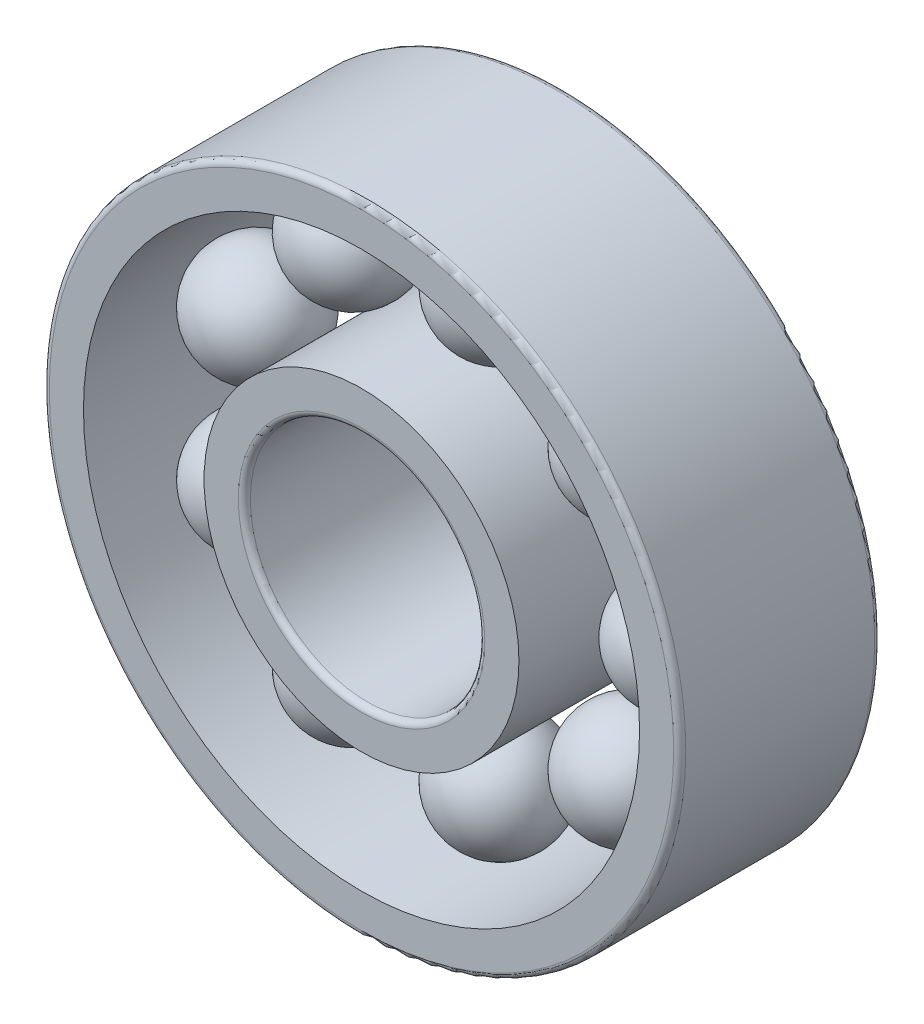
ISO-10303-21;
HEADER;
FILE_DESCRIPTION(('STEP AP214'),'2;1');
FILE_NAME('part.step','',(''),(''),'','','');
FILE_SCHEMA(('AUTOMOTIVE_DESIGN { 1 0 10303 214 1 1 1 1 }'));
ENDSEC;
DATA;
#1=APPLICATION_CONTEXT('core data for automotive mechanical design processes');
#2=APPLICATION_PROTOCOL_DEFINITION('international standard','automotive_design',2000,#1);
#3=PRODUCT_CONTEXT('',#1,'mechanical');
#4=PRODUCT('Part','Part','',(#3));
#5=PRODUCT_RELATED_PRODUCT_CATEGORY('part','',(#4));
#6=PRODUCT_DEFINITION_FORMATION('','',#4);
#7=PRODUCT_DEFINITION_CONTEXT('part definition',#1,'design');
#8=PRODUCT_DEFINITION('design','',#6,#7);
#9=PRODUCT_DEFINITION_SHAPE('','',#8);
#10=(LENGTH_UNIT() NAMED_UNIT(*) SI_UNIT(.MILLI.,.METRE.));
#11=(NAMED_UNIT(*) PLANE_ANGLE_UNIT() SI_UNIT($,.RADIAN.));
#12=(NAMED_UNIT(*) SI_UNIT($,.STERADIAN.) SOLID_ANGLE_UNIT());
#13=UNCERTAINTY_MEASURE_WITH_UNIT(LENGTH_MEASURE(1.E-05),#10,'distance_accuracy_value','');
#14=(GEOMETRIC_REPRESENTATION_CONTEXT(3) GLOBAL_UNCERTAINTY_ASSIGNED_CONTEXT((#13)) GLOBAL_UNIT_ASSIGNED_CONTEXT((#10,
#11,#12)) REPRESENTATION_CONTEXT('',''));
#15=CARTESIAN_POINT('',(0.,0.,0.));
#16=DIRECTION('',(0.,0.,1.));
#17=DIRECTION('',(1.,0.,0.));
#18=AXIS2_PLACEMENT_3D('',#15,#16,#17);
#19=CARTESIAN_POINT('',(4.97928888027336,-4.17811946296251,0.));
#20=DIRECTION('',(-0.766044443118978,0.64278760968654,0.));
#21=DIRECTION('',(0.,0.,-1.));
#22=AXIS2_PLACEMENT_3D('',#19,#20,#21);
#23=SPHERICAL_SURFACE('',#22,1.71);
#24=CARTESIAN_POINT('',(3.6693528825399,-3.07895265039852,0.));
#25=VERTEX_POINT('',#24);
#26=VERTEX_LOOP('',#25);
#27=FACE_BOUND('',#26,.T.);
#28=ADVANCED_FACE('F38',(#27),#23,.T.);
#29=CLOSED_SHELL('',(#28));
#30=MANIFOLD_SOLID_BREP('B2',#29);
#31=CARTESIAN_POINT('',(1.12871315483504,-6.40125039457935,0.));
#32=DIRECTION('',(-0.17364817766693,0.984807753012208,0.));
#33=DIRECTION('',(0.,0.,-1.));
#34=AXIS2_PLACEMENT_3D('',#31,#32,#33);
#35=SPHERICAL_SURFACE('',#34,1.71);
#36=CARTESIAN_POINT('',(0.831774771024595,-4.71722913692848,0.));
#37=VERTEX_POINT('',#36);
#38=VERTEX_LOOP('',#37);
#39=FACE_BOUND('',#38,.T.);
#40=ADVANCED_FACE('F57',(#39),#35,.T.);
#41=CLOSED_SHELL('',(#40));
#42=MANIFOLD_SOLID_BREP('B6',#41);
#43=CARTESIAN_POINT('',(-3.25,-5.62916512459885,0.));
#44=DIRECTION('',(0.5,0.866025403784438,0.));
#45=DIRECTION('',(0.,0.,-1.));
#46=AXIS2_PLACEMENT_3D('',#43,#44,#45);
#47=SPHERICAL_SURFACE('',#46,1.71);
#48=CARTESIAN_POINT('',(-2.395,-4.14826168412746,0.));
#49=VERTEX_POINT('',#48);
#50=VERTEX_LOOP('',#49);
#51=FACE_BOUND('',#50,.T.);
#52=ADVANCED_FACE('F76',(#51),#47,.T.);
#53=CLOSED_SHELL('',(#52));
#54=MANIFOLD_SOLID_BREP('B34',#53);
#55=CARTESIAN_POINT('',(-6.10800203510841,-2.22313093161685,0.));
#56=DIRECTION('',(0.939692620785908,0.342020143325669,0.));
#57=DIRECTION('',(0.,0.,-1.));
#58=AXIS2_PLACEMENT_3D('',#55,#56,#57);
#59=SPHERICAL_SURFACE('',#58,1.71);
#60=CARTESIAN_POINT('',(-4.5011276535645,-1.63827648652995,0.));
#61=VERTEX_POINT('',#60);
#62=VERTEX_LOOP('',#61);
#63=FACE_BOUND('',#62,.T.);
#64=ADVANCED_FACE('F95',(#63),#59,.T.);
#65=CLOSED_SHELL('',(#64));
#66=MANIFOLD_SOLID_BREP('B53',#65);
#67=CARTESIAN_POINT('',(-6.10800203510841,2.22313093161685,0.));
#68=DIRECTION('',(0.939692620785909,-0.342020143325669,0.));
#69=DIRECTION('',(0.,0.,-1.));
#70=AXIS2_PLACEMENT_3D('',#67,#68,#69);
#71=SPHERICAL_SURFACE('',#70,1.71);
#72=CARTESIAN_POINT('',(-4.5011276535645,1.63827648652995,0.));
#73=VERTEX_POINT('',#72);
#74=VERTEX_LOOP('',#73);
#75=FACE_BOUND('',#74,.T.);
#76=ADVANCED_FACE('F114',(#75),#71,.T.);
#77=CLOSED_SHELL('',(#76));
#78=MANIFOLD_SOLID_BREP('B72',#77);
#79=CARTESIAN_POINT('',(-3.25,5.62916512459885,0.));
#80=DIRECTION('',(0.5,-0.866025403784439,0.));
#81=DIRECTION('',(0.,0.,-1.));
#82=AXIS2_PLACEMENT_3D('',#79,#80,#81);
#83=SPHERICAL_SURFACE('',#82,1.71);
#84=CARTESIAN_POINT('',(-2.395,4.14826168412746,0.));
#85=VERTEX_POINT('',#84);
#86=VERTEX_LOOP('',#85);
#87=FACE_BOUND('',#86,.T.);
#88=ADVANCED_FACE('F133',(#87),#83,.T.);
#89=CLOSED_SHELL('',(#88));
#90=MANIFOLD_SOLID_BREP('B91',#89);
#91=CARTESIAN_POINT('',(1.12871315483505,6.40125039457935,0.));
#92=DIRECTION('',(-0.17364817766693,-0.984807753012208,0.));
#93=DIRECTION('',(0.,0.,-1.));
#94=AXIS2_PLACEMENT_3D('',#91,#92,#93);
#95=SPHERICAL_SURFACE('',#94,1.71);
#96=CARTESIAN_POINT('',(0.831774771024597,4.71722913692848,0.));
#97=VERTEX_POINT('',#96);
#98=VERTEX_LOOP('',#97);
#99=FACE_BOUND('',#98,.T.);
#100=ADVANCED_FACE('F152',(#99),#95,.T.);
#101=CLOSED_SHELL('',(#100));
#102=MANIFOLD_SOLID_BREP('B110',#101);
#103=CARTESIAN_POINT('',(4.97928888027336,4.17811946296251,0.));
#104=DIRECTION('',(-0.766044443118978,-0.642787609686539,0.));
#105=DIRECTION('',(0.,0.,-1.));
#106=AXIS2_PLACEMENT_3D('',#103,#104,#105);
#107=SPHERICAL_SURFACE('',#106,1.71);
#108=CARTESIAN_POINT('',(3.66935288253991,3.07895265039852,0.));
#109=VERTEX_POINT('',#108);
#110=VERTEX_LOOP('',#109);
#111=FACE_BOUND('',#110,.T.);
#112=ADVANCED_FACE('F171',(#111),#107,.T.);
#113=CLOSED_SHELL('',(#112));
#114=MANIFOLD_SOLID_BREP('B129',#113);
#115=CARTESIAN_POINT('',(6.5,0.,0.));
#116=DIRECTION('',(-1.,0.,0.));
#117=DIRECTION('',(0.,0.,-1.));
#118=AXIS2_PLACEMENT_3D('',#115,#116,#117);
#119=SPHERICAL_SURFACE('',#118,1.71);
#120=CARTESIAN_POINT('',(4.79,0.,0.));
#121=VERTEX_POINT('',#120);
#122=VERTEX_LOOP('',#121);
#123=FACE_BOUND('',#122,.T.);
#124=ADVANCED_FACE('F192',(#123),#119,.T.);
#125=CLOSED_SHELL('',(#124));
#126=MANIFOLD_SOLID_BREP('B148',#125);
#127=CARTESIAN_POINT('',(0.,0.,5.5));
#128=DIRECTION('',(0.,0.,1.));
#129=DIRECTION('',(1.,0.,0.));
#130=AXIS2_PLACEMENT_3D('',#127,#128,#129);
#131=CYLINDRICAL_SURFACE('',#130,8.3);
#132=CARTESIAN_POINT('',(0.,0.,3.));
#133=DIRECTION('',(0.,0.,1.));
#134=DIRECTION('',(1.,0.,0.));
#135=AXIS2_PLACEMENT_3D('',#132,#133,#134);
#136=CIRCLE('',#135,8.3);
#137=CARTESIAN_POINT('',(8.3,0.,3.));
#138=VERTEX_POINT('',#137);
#139=EDGE_CURVE('E232',#138,#138,#136,.T.);
#140=ORIENTED_EDGE('',*,*,#139,.T.);
#141=EDGE_LOOP('',(#140));
#142=FACE_BOUND('',#141,.T.);
#143=CARTESIAN_POINT('',(0.,0.,-3.));
#144=DIRECTION('',(0.,0.,1.));
#145=DIRECTION('',(1.,0.,0.));
#146=AXIS2_PLACEMENT_3D('',#143,#144,#145);
#147=CIRCLE('',#146,8.3);
#148=CARTESIAN_POINT('',(8.3,0.,-3.));
#149=VERTEX_POINT('',#148);
#150=EDGE_CURVE('E235',#149,#149,#147,.T.);
#151=ORIENTED_EDGE('',*,*,#150,.F.);
#152=EDGE_LOOP('',(#151));
#153=FACE_BOUND('',#152,.T.);
#154=ADVANCED_FACE('F212',(#142,#153),#131,.F.);
#155=CARTESIAN_POINT('',(8.3,0.,3.));
#156=DIRECTION('',(0.,0.,1.));
#157=DIRECTION('',(1.,0.,0.));
#158=AXIS2_PLACEMENT_3D('',#155,#156,#157);
#159=PLANE('',#158);
#160=CARTESIAN_POINT('',(0.,0.,3.));
#161=DIRECTION('',(0.,0.,1.));
#162=DIRECTION('',(1.,0.,0.));
#163=AXIS2_PLACEMENT_3D('',#160,#161,#162);
#164=CIRCLE('',#163,9.32);
#165=CARTESIAN_POINT('',(9.32,0.,3.));
#166=VERTEX_POINT('',#165);
#167=EDGE_CURVE('E191',#166,#166,#164,.T.);
#168=ORIENTED_EDGE('',*,*,#167,.T.);
#169=EDGE_LOOP('',(#168));
#170=FACE_BOUND('',#169,.T.);
#171=ORIENTED_EDGE('',*,*,#139,.F.);
#172=EDGE_LOOP('',(#171));
#173=FACE_BOUND('',#172,.T.);
#174=ADVANCED_FACE('F242',(#170,#173),#159,.T.);
#175=CARTESIAN_POINT('',(0.,0.,5.5));
#176=DIRECTION('',(0.,0.,1.));
#177=DIRECTION('',(1.,0.,0.));
#178=AXIS2_PLACEMENT_3D('',#175,#176,#177);
#179=CYLINDRICAL_SURFACE('',#178,9.5);
#180=CARTESIAN_POINT('',(0.,0.,-2.82));
#181=DIRECTION('',(0.,0.,-1.));
#182=DIRECTION('',(-1.,0.,0.));
#183=AXIS2_PLACEMENT_3D('',#180,#181,#182);
#184=CIRCLE('',#183,9.5);
#185=CARTESIAN_POINT('',(-9.5,0.,-2.82));
#186=VERTEX_POINT('',#185);
#187=EDGE_CURVE('E223',#186,#186,#184,.F.);
#188=ORIENTED_EDGE('',*,*,#187,.T.);
#189=EDGE_LOOP('',(#188));
#190=FACE_BOUND('',#189,.T.);
#191=CARTESIAN_POINT('',(0.,0.,2.82));
#192=DIRECTION('',(0.,0.,1.));
#193=DIRECTION('',(1.,0.,0.));
#194=AXIS2_PLACEMENT_3D('',#191,#192,#193);
#195=CIRCLE('',#194,9.5);
#196=CARTESIAN_POINT('',(9.5,0.,2.82));
#197=VERTEX_POINT('',#196);
#198=EDGE_CURVE('E227',#197,#197,#195,.F.);
#199=ORIENTED_EDGE('',*,*,#198,.T.);
#200=EDGE_LOOP('',(#199));
#201=FACE_BOUND('',#200,.T.);
#202=ADVANCED_FACE('F248',(#190,#201),#179,.T.);
#203=CARTESIAN_POINT('',(9.5,0.,-3.));
#204=DIRECTION('',(0.,0.,-1.));
#205=DIRECTION('',(-1.,0.,0.));
#206=AXIS2_PLACEMENT_3D('',#203,#204,#205);
#207=PLANE('',#206);
#208=CARTESIAN_POINT('',(0.,0.,-3.));
#209=DIRECTION('',(0.,0.,-1.));
#210=DIRECTION('',(-1.,0.,0.));
#211=AXIS2_PLACEMENT_3D('',#208,#209,#210);
#212=CIRCLE('',#211,9.32);
#213=CARTESIAN_POINT('',(-9.32,0.,-3.));
#214=VERTEX_POINT('',#213);
#215=EDGE_CURVE('E219',#214,#214,#212,.T.);
#216=ORIENTED_EDGE('',*,*,#215,.T.);
#217=EDGE_LOOP('',(#216));
#218=FACE_BOUND('',#217,.T.);
#219=ORIENTED_EDGE('',*,*,#150,.T.);
#220=EDGE_LOOP('',(#219));
#221=FACE_BOUND('',#220,.T.);
#222=ADVANCED_FACE('F239',(#218,#221),#207,.T.);
#223=CARTESIAN_POINT('',(0.,0.,-2.82));
#224=DIRECTION('',(0.,0.,-1.));
#225=DIRECTION('',(-1.,0.,0.));
#226=AXIS2_PLACEMENT_3D('',#223,#224,#225);
#227=TOROIDAL_SURFACE('',#226,9.32,0.18);
#228=ORIENTED_EDGE('',*,*,#215,.F.);
#229=EDGE_LOOP('',(#228));
#230=FACE_BOUND('',#229,.T.);
#231=ORIENTED_EDGE('',*,*,#187,.F.);
#232=EDGE_LOOP('',(#231));
#233=FACE_BOUND('',#232,.T.);
#234=ADVANCED_FACE('F251',(#230,#233),#227,.T.);
#235=CARTESIAN_POINT('',(0.,0.,2.82));
#236=DIRECTION('',(0.,0.,1.));
#237=DIRECTION('',(1.,0.,0.));
#238=AXIS2_PLACEMENT_3D('',#235,#236,#237);
#239=TOROIDAL_SURFACE('',#238,9.32,0.18);
#240=ORIENTED_EDGE('',*,*,#198,.F.);
#241=EDGE_LOOP('',(#240));
#242=FACE_BOUND('',#241,.T.);
#243=ORIENTED_EDGE('',*,*,#167,.F.);
#244=EDGE_LOOP('',(#243));
#245=FACE_BOUND('',#244,.T.);
#246=ADVANCED_FACE('F214',(#242,#245),#239,.T.);
#247=CLOSED_SHELL('',(#154,#174,#202,#222,#234,#246));
#248=MANIFOLD_SOLID_BREP('B167',#247);
#249=CARTESIAN_POINT('',(0.,0.,5.5));
#250=DIRECTION('',(0.,0.,1.));
#251=DIRECTION('',(1.,0.,0.));
#252=AXIS2_PLACEMENT_3D('',#249,#250,#251);
#253=CYLINDRICAL_SURFACE('',#252,3.5);
#254=CARTESIAN_POINT('',(0.,0.,-2.82));
#255=DIRECTION('',(0.,0.,-1.));
#256=DIRECTION('',(-1.,0.,0.));
#257=AXIS2_PLACEMENT_3D('',#254,#255,#256);
#258=CIRCLE('',#257,3.5);
#259=CARTESIAN_POINT('',(-3.5,0.,-2.82));
#260=VERTEX_POINT('',#259);
#261=EDGE_CURVE('E311',#260,#260,#258,.T.);
#262=ORIENTED_EDGE('',*,*,#261,.T.);
#263=EDGE_LOOP('',(#262));
#264=FACE_BOUND('',#263,.T.);
#265=CARTESIAN_POINT('',(0.,0.,2.82));
#266=DIRECTION('',(0.,0.,1.));
#267=DIRECTION('',(1.,0.,0.));
#268=AXIS2_PLACEMENT_3D('',#265,#266,#267);
#269=CIRCLE('',#268,3.5);
#270=CARTESIAN_POINT('',(3.5,0.,2.82));
#271=VERTEX_POINT('',#270);
#272=EDGE_CURVE('E315',#271,#271,#269,.T.);
#273=ORIENTED_EDGE('',*,*,#272,.T.);
#274=EDGE_LOOP('',(#273));
#275=FACE_BOUND('',#274,.T.);
#276=ADVANCED_FACE('F304',(#264,#275),#253,.F.);
#277=CARTESIAN_POINT('',(3.5,0.,3.));
#278=DIRECTION('',(0.,0.,1.));
#279=DIRECTION('',(1.,0.,0.));
#280=AXIS2_PLACEMENT_3D('',#277,#278,#279);
#281=PLANE('',#280);
#282=CARTESIAN_POINT('',(0.,0.,3.));
#283=DIRECTION('',(0.,0.,1.));
#284=DIRECTION('',(1.,0.,0.));
#285=AXIS2_PLACEMENT_3D('',#282,#283,#284);
#286=CIRCLE('',#285,3.68);
#287=CARTESIAN_POINT('',(3.68,0.,3.));
#288=VERTEX_POINT('',#287);
#289=EDGE_CURVE('E211',#288,#288,#286,.F.);
#290=ORIENTED_EDGE('',*,*,#289,.T.);
#291=EDGE_LOOP('',(#290));
#292=FACE_BOUND('',#291,.T.);
#293=CARTESIAN_POINT('',(0.,0.,3.));
#294=DIRECTION('',(0.,0.,1.));
#295=DIRECTION('',(1.,0.,0.));
#296=AXIS2_PLACEMENT_3D('',#293,#294,#295);
#297=CIRCLE('',#296,4.7);
#298=CARTESIAN_POINT('',(4.7,0.,3.));
#299=VERTEX_POINT('',#298);
#300=EDGE_CURVE('E324',#299,#299,#297,.T.);
#301=ORIENTED_EDGE('',*,*,#300,.T.);
#302=EDGE_LOOP('',(#301));
#303=FACE_BOUND('',#302,.T.);
#304=ADVANCED_FACE('F344',(#292,#303),#281,.T.);
#305=CARTESIAN_POINT('',(0.,0.,5.5));
#306=DIRECTION('',(0.,0.,1.));
#307=DIRECTION('',(1.,0.,0.));
#308=AXIS2_PLACEMENT_3D('',#305,#306,#307);
#309=CYLINDRICAL_SURFACE('',#308,4.7);
#310=CARTESIAN_POINT('',(0.,0.,-3.));
#311=DIRECTION('',(0.,0.,1.));
#312=DIRECTION('',(1.,0.,0.));
#313=AXIS2_PLACEMENT_3D('',#310,#311,#312);
#314=CIRCLE('',#313,4.7);
#315=CARTESIAN_POINT('',(4.7,0.,-3.));
#316=VERTEX_POINT('',#315);
#317=EDGE_CURVE('E327',#316,#316,#314,.T.);
#318=ORIENTED_EDGE('',*,*,#317,.T.);
#319=EDGE_LOOP('',(#318));
#320=FACE_BOUND('',#319,.T.);
#321=ORIENTED_EDGE('',*,*,#300,.F.);
#322=EDGE_LOOP('',(#321));
#323=FACE_BOUND('',#322,.T.);
#324=ADVANCED_FACE('F331',(#320,#323),#309,.T.);
#325=CARTESIAN_POINT('',(4.7,0.,-3.));
#326=DIRECTION('',(0.,0.,-1.));
#327=DIRECTION('',(-1.,0.,0.));
#328=AXIS2_PLACEMENT_3D('',#325,#326,#327);
#329=PLANE('',#328);
#330=CARTESIAN_POINT('',(0.,0.,-3.));
#331=DIRECTION('',(0.,0.,-1.));
#332=DIRECTION('',(-1.,0.,0.));
#333=AXIS2_PLACEMENT_3D('',#330,#331,#332);
#334=CIRCLE('',#333,3.68);
#335=CARTESIAN_POINT('',(-3.68,0.,-3.));
#336=VERTEX_POINT('',#335);
#337=EDGE_CURVE('E319',#336,#336,#334,.F.);
#338=ORIENTED_EDGE('',*,*,#337,.T.);
#339=EDGE_LOOP('',(#338));
#340=FACE_BOUND('',#339,.T.);
#341=ORIENTED_EDGE('',*,*,#317,.F.);
#342=EDGE_LOOP('',(#341));
#343=FACE_BOUND('',#342,.T.);
#344=ADVANCED_FACE('F334',(#340,#343),#329,.T.);
#345=CARTESIAN_POINT('',(0.,0.,-2.82));
#346=DIRECTION('',(0.,0.,-1.));
#347=DIRECTION('',(-1.,0.,0.));
#348=AXIS2_PLACEMENT_3D('',#345,#346,#347);
#349=TOROIDAL_SURFACE('',#348,3.68,0.18);
#350=ORIENTED_EDGE('',*,*,#261,.F.);
#351=EDGE_LOOP('',(#350));
#352=FACE_BOUND('',#351,.T.);
#353=ORIENTED_EDGE('',*,*,#337,.F.);
#354=EDGE_LOOP('',(#353));
#355=FACE_BOUND('',#354,.T.);
#356=ADVANCED_FACE('F336',(#352,#355),#349,.T.);
#357=CARTESIAN_POINT('',(0.,0.,2.82));
#358=DIRECTION('',(0.,0.,1.));
#359=DIRECTION('',(1.,0.,0.));
#360=AXIS2_PLACEMENT_3D('',#357,#358,#359);
#361=TOROIDAL_SURFACE('',#360,3.68,0.18);
#362=ORIENTED_EDGE('',*,*,#289,.F.);
#363=EDGE_LOOP('',(#362));
#364=FACE_BOUND('',#363,.T.);
#365=ORIENTED_EDGE('',*,*,#272,.F.);
#366=EDGE_LOOP('',(#365));
#367=FACE_BOUND('',#366,.T.);
#368=ADVANCED_FACE('F306',(#364,#367),#361,.T.);
#369=CLOSED_SHELL('',(#276,#304,#324,#344,#356,#368));
#370=MANIFOLD_SOLID_BREP('B186',#369);
#371=ADVANCED_BREP_SHAPE_REPRESENTATION('',(#18,#30,#42,#54,#66,#78,#90,#102,#114,#126,#248,
#370),#14);
#372=SHAPE_DEFINITION_REPRESENTATION(#9,#371);
ENDSEC;
END-ISO-10303-21;
